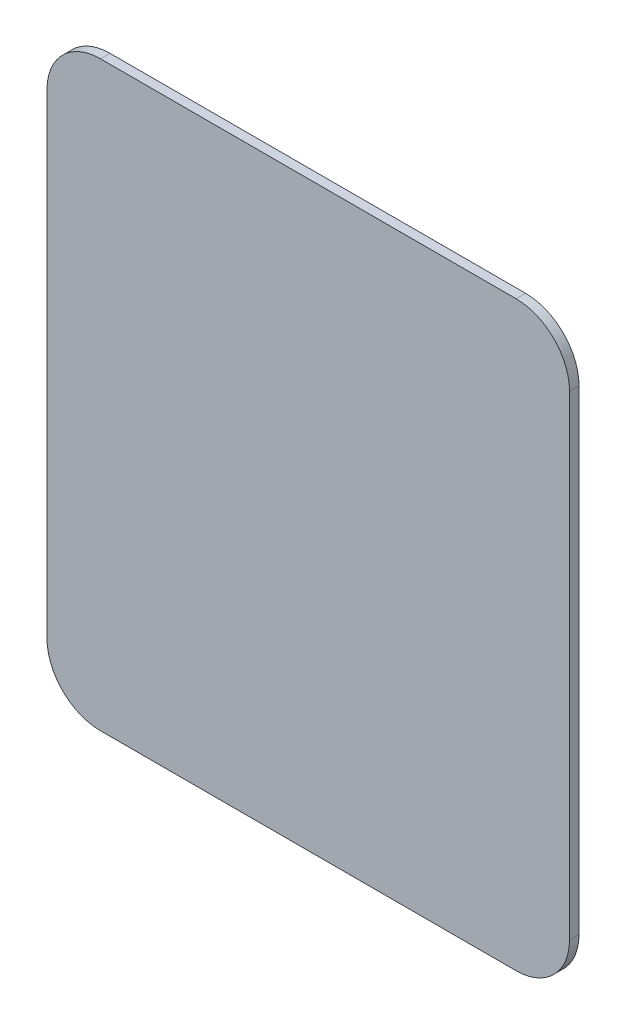
ISO-10303-21;
HEADER;
FILE_DESCRIPTION(('STEP AP214'),'2;1');
FILE_NAME('part.step','',(''),(''),'','','');
FILE_SCHEMA(('AUTOMOTIVE_DESIGN { 1 0 10303 214 1 1 1 1 }'));
ENDSEC;
DATA;
#1=APPLICATION_CONTEXT('core data for automotive mechanical design processes');
#2=APPLICATION_PROTOCOL_DEFINITION('international standard','automotive_design',2000,#1);
#3=PRODUCT_CONTEXT('',#1,'mechanical');
#4=PRODUCT('Part','Part','',(#3));
#5=PRODUCT_RELATED_PRODUCT_CATEGORY('part','',(#4));
#6=PRODUCT_DEFINITION_FORMATION('','',#4);
#7=PRODUCT_DEFINITION_CONTEXT('part definition',#1,'design');
#8=PRODUCT_DEFINITION('design','',#6,#7);
#9=PRODUCT_DEFINITION_SHAPE('','',#8);
#10=(LENGTH_UNIT() NAMED_UNIT(*) SI_UNIT(.MILLI.,.METRE.));
#11=(NAMED_UNIT(*) PLANE_ANGLE_UNIT() SI_UNIT($,.RADIAN.));
#12=(NAMED_UNIT(*) SI_UNIT($,.STERADIAN.) SOLID_ANGLE_UNIT());
#13=UNCERTAINTY_MEASURE_WITH_UNIT(LENGTH_MEASURE(1.E-05),#10,'distance_accuracy_value','');
#14=(GEOMETRIC_REPRESENTATION_CONTEXT(3) GLOBAL_UNCERTAINTY_ASSIGNED_CONTEXT((#13)) GLOBAL_UNIT_ASSIGNED_CONTEXT((#10,
#11,#12)) REPRESENTATION_CONTEXT('',''));
#15=CARTESIAN_POINT('',(0.,0.,0.));
#16=DIRECTION('',(0.,0.,1.));
#17=DIRECTION('',(1.,0.,0.));
#18=AXIS2_PLACEMENT_3D('',#15,#16,#17);
#19=CARTESIAN_POINT('',(-120.472694805059,50.2826367367701,1.6));
#20=DIRECTION('',(1.,0.,0.));
#21=DIRECTION('',(0.,1.,0.));
#22=AXIS2_PLACEMENT_3D('',#19,#20,#21);
#23=PLANE('',#22);
#24=DIRECTION('',(0.,-1.,0.));
#25=VECTOR('',#24,1.);
#26=CARTESIAN_POINT('',(-120.472694805059,50.2826367367701,0.));
#27=LINE('',#26,#25);
#28=CARTESIAN_POINT('',(-120.472694805059,41.2826367367701,0.));
#29=VERTEX_POINT('',#28);
#30=CARTESIAN_POINT('',(-120.472694805059,-38.7173632632299,0.));
#31=VERTEX_POINT('',#30);
#32=EDGE_CURVE('E130',#29,#31,#27,.T.);
#33=ORIENTED_EDGE('',*,*,#32,.T.);
#34=DIRECTION('',(0.,0.,-1.));
#35=VECTOR('',#34,1.);
#36=CARTESIAN_POINT('',(-120.472694805059,-38.7173632632299,1.6));
#37=LINE('',#36,#35);
#38=CARTESIAN_POINT('',(-120.472694805059,-38.7173632632299,1.6));
#39=VERTEX_POINT('',#38);
#40=EDGE_CURVE('E108',#31,#39,#37,.F.);
#41=ORIENTED_EDGE('',*,*,#40,.T.);
#42=DIRECTION('',(0.,-1.,0.));
#43=VECTOR('',#42,1.);
#44=CARTESIAN_POINT('',(-120.472694805059,50.2826367367701,1.6));
#45=LINE('',#44,#43);
#46=CARTESIAN_POINT('',(-120.472694805059,41.2826367367701,1.6));
#47=VERTEX_POINT('',#46);
#48=EDGE_CURVE('E139',#47,#39,#45,.T.);
#49=ORIENTED_EDGE('',*,*,#48,.F.);
#50=DIRECTION('',(0.,0.,-1.));
#51=VECTOR('',#50,1.);
#52=CARTESIAN_POINT('',(-120.472694805059,41.2826367367701,1.6));
#53=LINE('',#52,#51);
#54=EDGE_CURVE('E113',#47,#29,#53,.T.);
#55=ORIENTED_EDGE('',*,*,#54,.T.);
#56=EDGE_LOOP('',(#33,#41,#49,#55));
#57=FACE_BOUND('',#56,.T.);
#58=ADVANCED_FACE('F37',(#57),#23,.F.);
#59=CARTESIAN_POINT('',(-120.472694805059,-47.7173632632299,1.6));
#60=DIRECTION('',(0.,1.,0.));
#61=DIRECTION('',(0.,0.,1.));
#62=AXIS2_PLACEMENT_3D('',#59,#60,#61);
#63=PLANE('',#62);
#64=DIRECTION('',(1.,0.,0.));
#65=VECTOR('',#64,1.);
#66=CARTESIAN_POINT('',(-120.472694805059,-47.7173632632299,1.6));
#67=LINE('',#66,#65);
#68=CARTESIAN_POINT('',(-111.472694805059,-47.7173632632299,1.6));
#69=VERTEX_POINT('',#68);
#70=CARTESIAN_POINT('',(-41.4726948050592,-47.7173632632299,1.6));
#71=VERTEX_POINT('',#70);
#72=EDGE_CURVE('E123',#69,#71,#67,.T.);
#73=ORIENTED_EDGE('',*,*,#72,.F.);
#74=DIRECTION('',(0.,0.,-1.));
#75=VECTOR('',#74,1.);
#76=CARTESIAN_POINT('',(-111.472694805059,-47.7173632632299,1.6));
#77=LINE('',#76,#75);
#78=CARTESIAN_POINT('',(-111.472694805059,-47.7173632632299,0.));
#79=VERTEX_POINT('',#78);
#80=EDGE_CURVE('E107',#69,#79,#77,.T.);
#81=ORIENTED_EDGE('',*,*,#80,.T.);
#82=DIRECTION('',(1.,0.,0.));
#83=VECTOR('',#82,1.);
#84=CARTESIAN_POINT('',(-120.472694805059,-47.7173632632299,0.));
#85=LINE('',#84,#83);
#86=CARTESIAN_POINT('',(-41.4726948050592,-47.7173632632299,0.));
#87=VERTEX_POINT('',#86);
#88=EDGE_CURVE('E120',#79,#87,#85,.T.);
#89=ORIENTED_EDGE('',*,*,#88,.T.);
#90=DIRECTION('',(0.,0.,-1.));
#91=VECTOR('',#90,1.);
#92=CARTESIAN_POINT('',(-41.4726948050592,-47.7173632632299,1.6));
#93=LINE('',#92,#91);
#94=EDGE_CURVE('E125',#87,#71,#93,.F.);
#95=ORIENTED_EDGE('',*,*,#94,.T.);
#96=EDGE_LOOP('',(#73,#81,#89,#95));
#97=FACE_BOUND('',#96,.T.);
#98=ADVANCED_FACE('F119',(#97),#63,.F.);
#99=CARTESIAN_POINT('',(-32.4726948050592,50.2826367367701,1.6));
#100=DIRECTION('',(-1.,0.,0.));
#101=DIRECTION('',(0.,-1.,0.));
#102=AXIS2_PLACEMENT_3D('',#99,#100,#101);
#103=PLANE('',#102);
#104=DIRECTION('',(0.,1.,0.));
#105=VECTOR('',#104,1.);
#106=CARTESIAN_POINT('',(-32.4726948050592,50.2826367367701,1.6));
#107=LINE('',#106,#105);
#108=CARTESIAN_POINT('',(-32.4726948050592,-38.7173632632299,1.6));
#109=VERTEX_POINT('',#108);
#110=CARTESIAN_POINT('',(-32.4726948050592,41.2826367367701,1.6));
#111=VERTEX_POINT('',#110);
#112=EDGE_CURVE('E165',#109,#111,#107,.T.);
#113=ORIENTED_EDGE('',*,*,#112,.F.);
#114=DIRECTION('',(0.,0.,-1.));
#115=VECTOR('',#114,1.);
#116=CARTESIAN_POINT('',(-32.4726948050592,-38.7173632632299,1.6));
#117=LINE('',#116,#115);
#118=CARTESIAN_POINT('',(-32.4726948050592,-38.7173632632299,0.));
#119=VERTEX_POINT('',#118);
#120=EDGE_CURVE('E158',#109,#119,#117,.T.);
#121=ORIENTED_EDGE('',*,*,#120,.T.);
#122=DIRECTION('',(0.,1.,0.));
#123=VECTOR('',#122,1.);
#124=CARTESIAN_POINT('',(-32.4726948050592,50.2826367367701,0.));
#125=LINE('',#124,#123);
#126=CARTESIAN_POINT('',(-32.4726948050592,41.2826367367701,0.));
#127=VERTEX_POINT('',#126);
#128=EDGE_CURVE('E129',#119,#127,#125,.T.);
#129=ORIENTED_EDGE('',*,*,#128,.T.);
#130=DIRECTION('',(0.,0.,-1.));
#131=VECTOR('',#130,1.);
#132=CARTESIAN_POINT('',(-32.4726948050592,41.2826367367701,1.6));
#133=LINE('',#132,#131);
#134=EDGE_CURVE('E156',#127,#111,#133,.F.);
#135=ORIENTED_EDGE('',*,*,#134,.T.);
#136=EDGE_LOOP('',(#113,#121,#129,#135));
#137=FACE_BOUND('',#136,.T.);
#138=ADVANCED_FACE('F163',(#137),#103,.F.);
#139=CARTESIAN_POINT('',(-120.472694805059,50.2826367367701,1.6));
#140=DIRECTION('',(0.,-1.,0.));
#141=DIRECTION('',(0.,0.,-1.));
#142=AXIS2_PLACEMENT_3D('',#139,#140,#141);
#143=PLANE('',#142);
#144=DIRECTION('',(-1.,0.,0.));
#145=VECTOR('',#144,1.);
#146=CARTESIAN_POINT('',(-120.472694805059,50.2826367367701,1.6));
#147=LINE('',#146,#145);
#148=CARTESIAN_POINT('',(-41.4726948050592,50.2826367367701,1.6));
#149=VERTEX_POINT('',#148);
#150=CARTESIAN_POINT('',(-111.472694805059,50.2826367367701,1.6));
#151=VERTEX_POINT('',#150);
#152=EDGE_CURVE('E140',#149,#151,#147,.T.);
#153=ORIENTED_EDGE('',*,*,#152,.F.);
#154=DIRECTION('',(0.,0.,-1.));
#155=VECTOR('',#154,1.);
#156=CARTESIAN_POINT('',(-41.4726948050592,50.2826367367701,1.6));
#157=LINE('',#156,#155);
#158=CARTESIAN_POINT('',(-41.4726948050592,50.2826367367701,0.));
#159=VERTEX_POINT('',#158);
#160=EDGE_CURVE('E11',#149,#159,#157,.T.);
#161=ORIENTED_EDGE('',*,*,#160,.T.);
#162=DIRECTION('',(-1.,0.,0.));
#163=VECTOR('',#162,1.);
#164=CARTESIAN_POINT('',(-120.472694805059,50.2826367367701,0.));
#165=LINE('',#164,#163);
#166=CARTESIAN_POINT('',(-111.472694805059,50.2826367367701,0.));
#167=VERTEX_POINT('',#166);
#168=EDGE_CURVE('E133',#159,#167,#165,.T.);
#169=ORIENTED_EDGE('',*,*,#168,.T.);
#170=DIRECTION('',(0.,0.,-1.));
#171=VECTOR('',#170,1.);
#172=CARTESIAN_POINT('',(-111.472694805059,50.2826367367701,1.6));
#173=LINE('',#172,#171);
#174=EDGE_CURVE('E45',#167,#151,#173,.F.);
#175=ORIENTED_EDGE('',*,*,#174,.T.);
#176=EDGE_LOOP('',(#153,#161,#169,#175));
#177=FACE_BOUND('',#176,.T.);
#178=ADVANCED_FACE('F172',(#177),#143,.F.);
#179=CARTESIAN_POINT('',(0.,0.,1.6));
#180=DIRECTION('',(0.,0.,1.));
#181=DIRECTION('',(1.,0.,0.));
#182=AXIS2_PLACEMENT_3D('',#179,#180,#181);
#183=PLANE('',#182);
#184=ORIENTED_EDGE('',*,*,#48,.T.);
#185=CARTESIAN_POINT('',(-111.472694805059,-38.7173632632299,1.6));
#186=DIRECTION('',(0.,0.,1.));
#187=DIRECTION('',(1.,0.,0.));
#188=AXIS2_PLACEMENT_3D('',#185,#186,#187);
#189=CIRCLE('',#188,9.);
#190=EDGE_CURVE('E154',#39,#69,#189,.T.);
#191=ORIENTED_EDGE('',*,*,#190,.T.);
#192=ORIENTED_EDGE('',*,*,#72,.T.);
#193=CARTESIAN_POINT('',(-41.4726948050592,-38.7173632632299,1.6));
#194=DIRECTION('',(0.,0.,1.));
#195=DIRECTION('',(1.,0.,0.));
#196=AXIS2_PLACEMENT_3D('',#193,#194,#195);
#197=CIRCLE('',#196,9.);
#198=EDGE_CURVE('E152',#71,#109,#197,.T.);
#199=ORIENTED_EDGE('',*,*,#198,.T.);
#200=ORIENTED_EDGE('',*,*,#112,.T.);
#201=CARTESIAN_POINT('',(-41.4726948050592,41.2826367367701,1.6));
#202=DIRECTION('',(0.,0.,1.));
#203=DIRECTION('',(1.,0.,0.));
#204=AXIS2_PLACEMENT_3D('',#201,#202,#203);
#205=CIRCLE('',#204,9.);
#206=EDGE_CURVE('E58',#111,#149,#205,.T.);
#207=ORIENTED_EDGE('',*,*,#206,.T.);
#208=ORIENTED_EDGE('',*,*,#152,.T.);
#209=CARTESIAN_POINT('',(-111.472694805059,41.2826367367701,1.6));
#210=DIRECTION('',(0.,0.,1.));
#211=DIRECTION('',(1.,0.,0.));
#212=AXIS2_PLACEMENT_3D('',#209,#210,#211);
#213=CIRCLE('',#212,9.);
#214=EDGE_CURVE('E149',#151,#47,#213,.T.);
#215=ORIENTED_EDGE('',*,*,#214,.T.);
#216=EDGE_LOOP('',(#184,#191,#192,#199,#200,#207,#208,#215));
#217=FACE_BOUND('',#216,.T.);
#218=ADVANCED_FACE('F179',(#217),#183,.T.);
#219=CARTESIAN_POINT('',(0.,0.,0.));
#220=DIRECTION('',(0.,0.,1.));
#221=DIRECTION('',(1.,0.,0.));
#222=AXIS2_PLACEMENT_3D('',#219,#220,#221);
#223=PLANE('',#222);
#224=ORIENTED_EDGE('',*,*,#88,.F.);
#225=CARTESIAN_POINT('',(-111.472694805059,-38.7173632632299,0.));
#226=DIRECTION('',(0.,0.,1.));
#227=DIRECTION('',(1.,0.,0.));
#228=AXIS2_PLACEMENT_3D('',#225,#226,#227);
#229=CIRCLE('',#228,9.);
#230=EDGE_CURVE('E103',#79,#31,#229,.F.);
#231=ORIENTED_EDGE('',*,*,#230,.T.);
#232=ORIENTED_EDGE('',*,*,#32,.F.);
#233=CARTESIAN_POINT('',(-111.472694805059,41.2826367367701,0.));
#234=DIRECTION('',(0.,0.,1.));
#235=DIRECTION('',(1.,0.,0.));
#236=AXIS2_PLACEMENT_3D('',#233,#234,#235);
#237=CIRCLE('',#236,9.);
#238=EDGE_CURVE('E124',#29,#167,#237,.F.);
#239=ORIENTED_EDGE('',*,*,#238,.T.);
#240=ORIENTED_EDGE('',*,*,#168,.F.);
#241=CARTESIAN_POINT('',(-41.4726948050592,41.2826367367701,0.));
#242=DIRECTION('',(0.,0.,1.));
#243=DIRECTION('',(1.,0.,0.));
#244=AXIS2_PLACEMENT_3D('',#241,#242,#243);
#245=CIRCLE('',#244,9.);
#246=EDGE_CURVE('E143',#159,#127,#245,.F.);
#247=ORIENTED_EDGE('',*,*,#246,.T.);
#248=ORIENTED_EDGE('',*,*,#128,.F.);
#249=CARTESIAN_POINT('',(-41.4726948050592,-38.7173632632299,0.));
#250=DIRECTION('',(0.,0.,1.));
#251=DIRECTION('',(1.,0.,0.));
#252=AXIS2_PLACEMENT_3D('',#249,#250,#251);
#253=CIRCLE('',#252,9.);
#254=EDGE_CURVE('E114',#119,#87,#253,.F.);
#255=ORIENTED_EDGE('',*,*,#254,.T.);
#256=EDGE_LOOP('',(#224,#231,#232,#239,#240,#247,#248,#255));
#257=FACE_BOUND('',#256,.T.);
#258=ADVANCED_FACE('F127',(#257),#223,.F.);
#259=CARTESIAN_POINT('',(-111.472694805059,-38.7173632632299,1.6));
#260=DIRECTION('',(0.,0.,-1.));
#261=DIRECTION('',(-1.,0.,0.));
#262=AXIS2_PLACEMENT_3D('',#259,#260,#261);
#263=CYLINDRICAL_SURFACE('',#262,9.);
#264=ORIENTED_EDGE('',*,*,#190,.F.);
#265=ORIENTED_EDGE('',*,*,#40,.F.);
#266=ORIENTED_EDGE('',*,*,#230,.F.);
#267=ORIENTED_EDGE('',*,*,#80,.F.);
#268=EDGE_LOOP('',(#264,#265,#266,#267));
#269=FACE_BOUND('',#268,.T.);
#270=ADVANCED_FACE('F106',(#269),#263,.T.);
#271=CARTESIAN_POINT('',(-41.4726948050592,-38.7173632632299,1.6));
#272=DIRECTION('',(0.,0.,-1.));
#273=DIRECTION('',(-1.,0.,0.));
#274=AXIS2_PLACEMENT_3D('',#271,#272,#273);
#275=CYLINDRICAL_SURFACE('',#274,9.);
#276=ORIENTED_EDGE('',*,*,#198,.F.);
#277=ORIENTED_EDGE('',*,*,#94,.F.);
#278=ORIENTED_EDGE('',*,*,#254,.F.);
#279=ORIENTED_EDGE('',*,*,#120,.F.);
#280=EDGE_LOOP('',(#276,#277,#278,#279));
#281=FACE_BOUND('',#280,.T.);
#282=ADVANCED_FACE('F187',(#281),#275,.T.);
#283=CARTESIAN_POINT('',(-41.4726948050592,41.2826367367701,1.6));
#284=DIRECTION('',(0.,0.,-1.));
#285=DIRECTION('',(-1.,0.,0.));
#286=AXIS2_PLACEMENT_3D('',#283,#284,#285);
#287=CYLINDRICAL_SURFACE('',#286,9.);
#288=ORIENTED_EDGE('',*,*,#206,.F.);
#289=ORIENTED_EDGE('',*,*,#134,.F.);
#290=ORIENTED_EDGE('',*,*,#246,.F.);
#291=ORIENTED_EDGE('',*,*,#160,.F.);
#292=EDGE_LOOP('',(#288,#289,#290,#291));
#293=FACE_BOUND('',#292,.T.);
#294=ADVANCED_FACE('F171',(#293),#287,.T.);
#295=CARTESIAN_POINT('',(-111.472694805059,41.2826367367701,1.6));
#296=DIRECTION('',(0.,0.,-1.));
#297=DIRECTION('',(-1.,0.,0.));
#298=AXIS2_PLACEMENT_3D('',#295,#296,#297);
#299=CYLINDRICAL_SURFACE('',#298,9.);
#300=ORIENTED_EDGE('',*,*,#214,.F.);
#301=ORIENTED_EDGE('',*,*,#174,.F.);
#302=ORIENTED_EDGE('',*,*,#238,.F.);
#303=ORIENTED_EDGE('',*,*,#54,.F.);
#304=EDGE_LOOP('',(#300,#301,#302,#303));
#305=FACE_BOUND('',#304,.T.);
#306=ADVANCED_FACE('F39',(#305),#299,.T.);
#307=CLOSED_SHELL('',(#58,#98,#138,#178,#218,#258,#270,#282,#294,#306));
#308=MANIFOLD_SOLID_BREP('B2',#307);
#309=ADVANCED_BREP_SHAPE_REPRESENTATION('',(#18,#308),#14);
#310=SHAPE_DEFINITION_REPRESENTATION(#9,#309);
ENDSEC;
END-ISO-10303-21;
